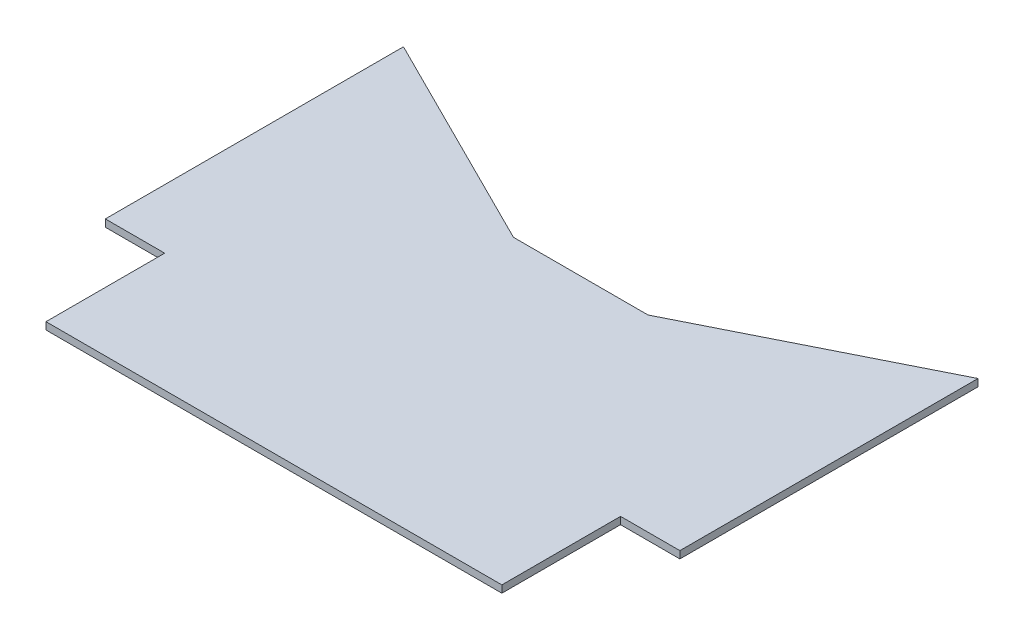
ISO-10303-21;
HEADER;
FILE_DESCRIPTION(('STEP AP214'),'2;1');
FILE_NAME('part.step','',(''),(''),'','','');
FILE_SCHEMA(('AUTOMOTIVE_DESIGN { 1 0 10303 214 1 1 1 1 }'));
ENDSEC;
DATA;
#1=APPLICATION_CONTEXT('core data for automotive mechanical design processes');
#2=APPLICATION_PROTOCOL_DEFINITION('international standard','automotive_design',2000,#1);
#3=PRODUCT_CONTEXT('',#1,'mechanical');
#4=PRODUCT('Part','Part','',(#3));
#5=PRODUCT_RELATED_PRODUCT_CATEGORY('part','',(#4));
#6=PRODUCT_DEFINITION_FORMATION('','',#4);
#7=PRODUCT_DEFINITION_CONTEXT('part definition',#1,'design');
#8=PRODUCT_DEFINITION('design','',#6,#7);
#9=PRODUCT_DEFINITION_SHAPE('','',#8);
#10=(LENGTH_UNIT() NAMED_UNIT(*) SI_UNIT(.MILLI.,.METRE.));
#11=(NAMED_UNIT(*) PLANE_ANGLE_UNIT() SI_UNIT($,.RADIAN.));
#12=(NAMED_UNIT(*) SI_UNIT($,.STERADIAN.) SOLID_ANGLE_UNIT());
#13=UNCERTAINTY_MEASURE_WITH_UNIT(LENGTH_MEASURE(1.E-05),#10,'distance_accuracy_value','');
#14=(GEOMETRIC_REPRESENTATION_CONTEXT(3) GLOBAL_UNCERTAINTY_ASSIGNED_CONTEXT((#13)) GLOBAL_UNIT_ASSIGNED_CONTEXT((#10,
#11,#12)) REPRESENTATION_CONTEXT('',''));
#15=CARTESIAN_POINT('',(0.,0.,0.));
#16=DIRECTION('',(0.,0.,1.));
#17=DIRECTION('',(1.,0.,0.));
#18=AXIS2_PLACEMENT_3D('',#15,#16,#17);
#19=CARTESIAN_POINT('',(-100.838,2.54,-146.304));
#20=DIRECTION('',(-0.447213595499958,0.,0.894427190999916));
#21=DIRECTION('',(0.894427190999916,0.,0.447213595499958));
#22=AXIS2_PLACEMENT_3D('',#19,#20,#21);
#23=PLANE('',#22);
#24=DIRECTION('',(-0.894427190999916,0.,-0.447213595499958));
#25=VECTOR('',#24,1.);
#26=CARTESIAN_POINT('',(-100.838,0.,-146.304));
#27=LINE('',#26,#25);
#28=CARTESIAN_POINT('',(-23.622,0.,-107.696));
#29=VERTEX_POINT('',#28);
#30=CARTESIAN_POINT('',(-100.838,0.,-146.304));
#31=VERTEX_POINT('',#30);
#32=EDGE_CURVE('E140',#29,#31,#27,.T.);
#33=ORIENTED_EDGE('',*,*,#32,.T.);
#34=DIRECTION('',(0.,-1.,0.));
#35=VECTOR('',#34,1.);
#36=CARTESIAN_POINT('',(-100.838,2.54,-146.304));
#37=LINE('',#36,#35);
#38=CARTESIAN_POINT('',(-100.838,2.54,-146.304));
#39=VERTEX_POINT('',#38);
#40=EDGE_CURVE('E11',#39,#31,#37,.T.);
#41=ORIENTED_EDGE('',*,*,#40,.F.);
#42=DIRECTION('',(-0.894427190999916,0.,-0.447213595499958));
#43=VECTOR('',#42,1.);
#44=CARTESIAN_POINT('',(-100.838,2.54,-146.304));
#45=LINE('',#44,#43);
#46=CARTESIAN_POINT('',(-23.622,2.54,-107.696));
#47=VERTEX_POINT('',#46);
#48=EDGE_CURVE('E159',#47,#39,#45,.T.);
#49=ORIENTED_EDGE('',*,*,#48,.F.);
#50=DIRECTION('',(0.,-1.,0.));
#51=VECTOR('',#50,1.);
#52=CARTESIAN_POINT('',(-23.622,2.54,-107.696));
#53=LINE('',#52,#51);
#54=EDGE_CURVE('E136',#47,#29,#53,.T.);
#55=ORIENTED_EDGE('',*,*,#54,.T.);
#56=EDGE_LOOP('',(#33,#41,#49,#55));
#57=FACE_BOUND('',#56,.T.);
#58=ADVANCED_FACE('F33',(#57),#23,.F.);
#59=CARTESIAN_POINT('',(-100.838,2.54,-41.656));
#60=DIRECTION('',(1.,0.,0.));
#61=DIRECTION('',(0.,0.,-1.));
#62=AXIS2_PLACEMENT_3D('',#59,#60,#61);
#63=PLANE('',#62);
#64=DIRECTION('',(0.,0.,1.));
#65=VECTOR('',#64,1.);
#66=CARTESIAN_POINT('',(-100.838,0.,-41.656));
#67=LINE('',#66,#65);
#68=CARTESIAN_POINT('',(-100.838,0.,-41.656));
#69=VERTEX_POINT('',#68);
#70=EDGE_CURVE('E143',#31,#69,#67,.T.);
#71=ORIENTED_EDGE('',*,*,#70,.T.);
#72=DIRECTION('',(0.,-1.,0.));
#73=VECTOR('',#72,1.);
#74=CARTESIAN_POINT('',(-100.838,2.54,-41.656));
#75=LINE('',#74,#73);
#76=CARTESIAN_POINT('',(-100.838,2.54,-41.656));
#77=VERTEX_POINT('',#76);
#78=EDGE_CURVE('E41',#77,#69,#75,.T.);
#79=ORIENTED_EDGE('',*,*,#78,.F.);
#80=DIRECTION('',(0.,0.,1.));
#81=VECTOR('',#80,1.);
#82=CARTESIAN_POINT('',(-100.838,2.54,-51.308));
#83=LINE('',#82,#81);
#84=EDGE_CURVE('E98',#39,#77,#83,.T.);
#85=ORIENTED_EDGE('',*,*,#84,.F.);
#86=ORIENTED_EDGE('',*,*,#40,.T.);
#87=EDGE_LOOP('',(#71,#79,#85,#86));
#88=FACE_BOUND('',#87,.T.);
#89=ADVANCED_FACE('F208',(#88),#63,.F.);
#90=CARTESIAN_POINT('',(-80.01,2.54,-41.656));
#91=DIRECTION('',(0.,0.,-1.));
#92=DIRECTION('',(-1.,0.,0.));
#93=AXIS2_PLACEMENT_3D('',#90,#91,#92);
#94=PLANE('',#93);
#95=DIRECTION('',(1.,0.,0.));
#96=VECTOR('',#95,1.);
#97=CARTESIAN_POINT('',(-80.01,0.,-41.656));
#98=LINE('',#97,#96);
#99=CARTESIAN_POINT('',(-80.01,0.,-41.656));
#100=VERTEX_POINT('',#99);
#101=EDGE_CURVE('E145',#69,#100,#98,.T.);
#102=ORIENTED_EDGE('',*,*,#101,.T.);
#103=DIRECTION('',(0.,-1.,0.));
#104=VECTOR('',#103,1.);
#105=CARTESIAN_POINT('',(-80.01,2.54,-41.656));
#106=LINE('',#105,#104);
#107=CARTESIAN_POINT('',(-80.01,2.54,-41.656));
#108=VERTEX_POINT('',#107);
#109=EDGE_CURVE('E172',#108,#100,#106,.T.);
#110=ORIENTED_EDGE('',*,*,#109,.F.);
#111=DIRECTION('',(1.,0.,0.));
#112=VECTOR('',#111,1.);
#113=CARTESIAN_POINT('',(-80.01,2.54,-41.656));
#114=LINE('',#113,#112);
#115=EDGE_CURVE('E180',#77,#108,#114,.T.);
#116=ORIENTED_EDGE('',*,*,#115,.F.);
#117=ORIENTED_EDGE('',*,*,#78,.T.);
#118=EDGE_LOOP('',(#102,#110,#116,#117));
#119=FACE_BOUND('',#118,.T.);
#120=ADVANCED_FACE('F178',(#119),#94,.F.);
#121=CARTESIAN_POINT('',(-80.01,2.54,0.));
#122=DIRECTION('',(1.,0.,0.));
#123=DIRECTION('',(0.,0.,-1.));
#124=AXIS2_PLACEMENT_3D('',#121,#122,#123);
#125=PLANE('',#124);
#126=DIRECTION('',(0.,0.,1.));
#127=VECTOR('',#126,1.);
#128=CARTESIAN_POINT('',(-80.01,0.,0.));
#129=LINE('',#128,#127);
#130=CARTESIAN_POINT('',(-80.01,0.,0.));
#131=VERTEX_POINT('',#130);
#132=EDGE_CURVE('E147',#100,#131,#129,.T.);
#133=ORIENTED_EDGE('',*,*,#132,.T.);
#134=DIRECTION('',(0.,-1.,0.));
#135=VECTOR('',#134,1.);
#136=CARTESIAN_POINT('',(-80.01,2.54,0.));
#137=LINE('',#136,#135);
#138=CARTESIAN_POINT('',(-80.01,2.54,0.));
#139=VERTEX_POINT('',#138);
#140=EDGE_CURVE('E169',#139,#131,#137,.T.);
#141=ORIENTED_EDGE('',*,*,#140,.F.);
#142=DIRECTION('',(0.,0.,1.));
#143=VECTOR('',#142,1.);
#144=CARTESIAN_POINT('',(-80.01,2.54,0.));
#145=LINE('',#144,#143);
#146=EDGE_CURVE('E198',#108,#139,#145,.T.);
#147=ORIENTED_EDGE('',*,*,#146,.F.);
#148=ORIENTED_EDGE('',*,*,#109,.T.);
#149=EDGE_LOOP('',(#133,#141,#147,#148));
#150=FACE_BOUND('',#149,.T.);
#151=ADVANCED_FACE('F189',(#150),#125,.F.);
#152=CARTESIAN_POINT('',(-80.01,2.54,0.));
#153=DIRECTION('',(0.,0.,-1.));
#154=DIRECTION('',(-1.,0.,0.));
#155=AXIS2_PLACEMENT_3D('',#152,#153,#154);
#156=PLANE('',#155);
#157=DIRECTION('',(1.,0.,0.));
#158=VECTOR('',#157,1.);
#159=CARTESIAN_POINT('',(-80.01,0.,0.));
#160=LINE('',#159,#158);
#161=CARTESIAN_POINT('',(80.01,0.,0.));
#162=VERTEX_POINT('',#161);
#163=EDGE_CURVE('E149',#131,#162,#160,.T.);
#164=ORIENTED_EDGE('',*,*,#163,.T.);
#165=DIRECTION('',(0.,-1.,0.));
#166=VECTOR('',#165,1.);
#167=CARTESIAN_POINT('',(80.01,2.54,0.));
#168=LINE('',#167,#166);
#169=CARTESIAN_POINT('',(80.01,2.54,0.));
#170=VERTEX_POINT('',#169);
#171=EDGE_CURVE('E166',#170,#162,#168,.T.);
#172=ORIENTED_EDGE('',*,*,#171,.F.);
#173=DIRECTION('',(1.,0.,0.));
#174=VECTOR('',#173,1.);
#175=CARTESIAN_POINT('',(-80.01,2.54,0.));
#176=LINE('',#175,#174);
#177=EDGE_CURVE('E195',#139,#170,#176,.T.);
#178=ORIENTED_EDGE('',*,*,#177,.F.);
#179=ORIENTED_EDGE('',*,*,#140,.T.);
#180=EDGE_LOOP('',(#164,#172,#178,#179));
#181=FACE_BOUND('',#180,.T.);
#182=ADVANCED_FACE('F193',(#181),#156,.F.);
#183=CARTESIAN_POINT('',(80.01,2.54,0.));
#184=DIRECTION('',(-1.,0.,0.));
#185=DIRECTION('',(0.,0.,1.));
#186=AXIS2_PLACEMENT_3D('',#183,#184,#185);
#187=PLANE('',#186);
#188=DIRECTION('',(0.,0.,-1.));
#189=VECTOR('',#188,1.);
#190=CARTESIAN_POINT('',(80.01,0.,0.));
#191=LINE('',#190,#189);
#192=CARTESIAN_POINT('',(80.01,0.,-41.656));
#193=VERTEX_POINT('',#192);
#194=EDGE_CURVE('E151',#162,#193,#191,.T.);
#195=ORIENTED_EDGE('',*,*,#194,.T.);
#196=DIRECTION('',(0.,-1.,0.));
#197=VECTOR('',#196,1.);
#198=CARTESIAN_POINT('',(80.01,2.54,-41.656));
#199=LINE('',#198,#197);
#200=CARTESIAN_POINT('',(80.01,2.54,-41.656));
#201=VERTEX_POINT('',#200);
#202=EDGE_CURVE('E163',#201,#193,#199,.T.);
#203=ORIENTED_EDGE('',*,*,#202,.F.);
#204=DIRECTION('',(0.,0.,-1.));
#205=VECTOR('',#204,1.);
#206=CARTESIAN_POINT('',(80.01,2.54,0.));
#207=LINE('',#206,#205);
#208=EDGE_CURVE('E197',#170,#201,#207,.T.);
#209=ORIENTED_EDGE('',*,*,#208,.F.);
#210=ORIENTED_EDGE('',*,*,#171,.T.);
#211=EDGE_LOOP('',(#195,#203,#209,#210));
#212=FACE_BOUND('',#211,.T.);
#213=ADVANCED_FACE('F220',(#212),#187,.F.);
#214=CARTESIAN_POINT('',(80.01,2.54,-41.656));
#215=DIRECTION('',(0.,0.,-1.));
#216=DIRECTION('',(-1.,0.,0.));
#217=AXIS2_PLACEMENT_3D('',#214,#215,#216);
#218=PLANE('',#217);
#219=DIRECTION('',(1.,0.,0.));
#220=VECTOR('',#219,1.);
#221=CARTESIAN_POINT('',(80.01,0.,-41.656));
#222=LINE('',#221,#220);
#223=CARTESIAN_POINT('',(100.838,0.,-41.656));
#224=VERTEX_POINT('',#223);
#225=EDGE_CURVE('E153',#193,#224,#222,.T.);
#226=ORIENTED_EDGE('',*,*,#225,.T.);
#227=DIRECTION('',(0.,-1.,0.));
#228=VECTOR('',#227,1.);
#229=CARTESIAN_POINT('',(100.838,2.54,-41.656));
#230=LINE('',#229,#228);
#231=CARTESIAN_POINT('',(100.838,2.54,-41.656));
#232=VERTEX_POINT('',#231);
#233=EDGE_CURVE('E131',#232,#224,#230,.T.);
#234=ORIENTED_EDGE('',*,*,#233,.F.);
#235=DIRECTION('',(1.,0.,0.));
#236=VECTOR('',#235,1.);
#237=CARTESIAN_POINT('',(80.01,2.54,-41.656));
#238=LINE('',#237,#236);
#239=EDGE_CURVE('E123',#201,#232,#238,.T.);
#240=ORIENTED_EDGE('',*,*,#239,.F.);
#241=ORIENTED_EDGE('',*,*,#202,.T.);
#242=EDGE_LOOP('',(#226,#234,#240,#241));
#243=FACE_BOUND('',#242,.T.);
#244=ADVANCED_FACE('F223',(#243),#218,.F.);
#245=CARTESIAN_POINT('',(100.838,2.54,-51.308));
#246=DIRECTION('',(-1.,0.,0.));
#247=DIRECTION('',(0.,0.,1.));
#248=AXIS2_PLACEMENT_3D('',#245,#246,#247);
#249=PLANE('',#248);
#250=DIRECTION('',(0.,0.,-1.));
#251=VECTOR('',#250,1.);
#252=CARTESIAN_POINT('',(100.838,0.,-51.308));
#253=LINE('',#252,#251);
#254=CARTESIAN_POINT('',(100.838,0.,-146.304));
#255=VERTEX_POINT('',#254);
#256=EDGE_CURVE('E130',#224,#255,#253,.T.);
#257=ORIENTED_EDGE('',*,*,#256,.T.);
#258=DIRECTION('',(0.,-1.,0.));
#259=VECTOR('',#258,1.);
#260=CARTESIAN_POINT('',(100.838,2.54,-146.304));
#261=LINE('',#260,#259);
#262=CARTESIAN_POINT('',(100.838,2.54,-146.304));
#263=VERTEX_POINT('',#262);
#264=EDGE_CURVE('E128',#263,#255,#261,.T.);
#265=ORIENTED_EDGE('',*,*,#264,.F.);
#266=DIRECTION('',(0.,0.,-1.));
#267=VECTOR('',#266,1.);
#268=CARTESIAN_POINT('',(100.838,2.54,-41.656));
#269=LINE('',#268,#267);
#270=EDGE_CURVE('E117',#232,#263,#269,.T.);
#271=ORIENTED_EDGE('',*,*,#270,.F.);
#272=ORIENTED_EDGE('',*,*,#233,.T.);
#273=EDGE_LOOP('',(#257,#265,#271,#272));
#274=FACE_BOUND('',#273,.T.);
#275=ADVANCED_FACE('F129',(#274),#249,.F.);
#276=CARTESIAN_POINT('',(100.838,2.54,-146.304));
#277=DIRECTION('',(0.447213595499958,0.,0.894427190999916));
#278=DIRECTION('',(0.894427190999916,0.,-0.447213595499958));
#279=AXIS2_PLACEMENT_3D('',#276,#277,#278);
#280=PLANE('',#279);
#281=DIRECTION('',(-0.894427190999916,0.,0.447213595499958));
#282=VECTOR('',#281,1.);
#283=CARTESIAN_POINT('',(100.838,0.,-146.304));
#284=LINE('',#283,#282);
#285=CARTESIAN_POINT('',(23.622,0.,-107.696));
#286=VERTEX_POINT('',#285);
#287=EDGE_CURVE('E84',#255,#286,#284,.T.);
#288=ORIENTED_EDGE('',*,*,#287,.T.);
#289=DIRECTION('',(0.,-1.,0.));
#290=VECTOR('',#289,1.);
#291=CARTESIAN_POINT('',(23.622,2.54,-107.696));
#292=LINE('',#291,#290);
#293=CARTESIAN_POINT('',(23.622,2.54,-107.696));
#294=VERTEX_POINT('',#293);
#295=EDGE_CURVE('E132',#294,#286,#292,.T.);
#296=ORIENTED_EDGE('',*,*,#295,.F.);
#297=DIRECTION('',(-0.894427190999916,0.,0.447213595499958));
#298=VECTOR('',#297,1.);
#299=CARTESIAN_POINT('',(100.838,2.54,-146.304));
#300=LINE('',#299,#298);
#301=EDGE_CURVE('E121',#263,#294,#300,.T.);
#302=ORIENTED_EDGE('',*,*,#301,.F.);
#303=ORIENTED_EDGE('',*,*,#264,.T.);
#304=EDGE_LOOP('',(#288,#296,#302,#303));
#305=FACE_BOUND('',#304,.T.);
#306=ADVANCED_FACE('F134',(#305),#280,.F.);
#307=CARTESIAN_POINT('',(-23.622,2.54,-107.696));
#308=DIRECTION('',(0.,0.,1.));
#309=DIRECTION('',(1.,0.,0.));
#310=AXIS2_PLACEMENT_3D('',#307,#308,#309);
#311=PLANE('',#310);
#312=DIRECTION('',(-1.,0.,0.));
#313=VECTOR('',#312,1.);
#314=CARTESIAN_POINT('',(-23.622,0.,-107.696));
#315=LINE('',#314,#313);
#316=EDGE_CURVE('E90',#286,#29,#315,.T.);
#317=ORIENTED_EDGE('',*,*,#316,.T.);
#318=ORIENTED_EDGE('',*,*,#54,.F.);
#319=DIRECTION('',(-1.,0.,0.));
#320=VECTOR('',#319,1.);
#321=CARTESIAN_POINT('',(-23.622,2.54,-107.696));
#322=LINE('',#321,#320);
#323=EDGE_CURVE('E49',#294,#47,#322,.T.);
#324=ORIENTED_EDGE('',*,*,#323,.F.);
#325=ORIENTED_EDGE('',*,*,#295,.T.);
#326=EDGE_LOOP('',(#317,#318,#324,#325));
#327=FACE_BOUND('',#326,.T.);
#328=ADVANCED_FACE('F232',(#327),#311,.F.);
#329=CARTESIAN_POINT('',(0.,2.54,0.));
#330=DIRECTION('',(0.,1.,0.));
#331=DIRECTION('',(0.,0.,1.));
#332=AXIS2_PLACEMENT_3D('',#329,#330,#331);
#333=PLANE('',#332);
#334=ORIENTED_EDGE('',*,*,#48,.T.);
#335=ORIENTED_EDGE('',*,*,#84,.T.);
#336=ORIENTED_EDGE('',*,*,#115,.T.);
#337=ORIENTED_EDGE('',*,*,#146,.T.);
#338=ORIENTED_EDGE('',*,*,#177,.T.);
#339=ORIENTED_EDGE('',*,*,#208,.T.);
#340=ORIENTED_EDGE('',*,*,#239,.T.);
#341=ORIENTED_EDGE('',*,*,#270,.T.);
#342=ORIENTED_EDGE('',*,*,#301,.T.);
#343=ORIENTED_EDGE('',*,*,#323,.T.);
#344=EDGE_LOOP('',(#334,#335,#336,#337,#338,#339,#340,#341,#342,#343));
#345=FACE_BOUND('',#344,.T.);
#346=ADVANCED_FACE('F119',(#345),#333,.T.);
#347=CARTESIAN_POINT('',(0.,0.,0.));
#348=DIRECTION('',(0.,1.,0.));
#349=DIRECTION('',(0.,0.,1.));
#350=AXIS2_PLACEMENT_3D('',#347,#348,#349);
#351=PLANE('',#350);
#352=ORIENTED_EDGE('',*,*,#32,.F.);
#353=ORIENTED_EDGE('',*,*,#316,.F.);
#354=ORIENTED_EDGE('',*,*,#287,.F.);
#355=ORIENTED_EDGE('',*,*,#256,.F.);
#356=ORIENTED_EDGE('',*,*,#225,.F.);
#357=ORIENTED_EDGE('',*,*,#194,.F.);
#358=ORIENTED_EDGE('',*,*,#163,.F.);
#359=ORIENTED_EDGE('',*,*,#132,.F.);
#360=ORIENTED_EDGE('',*,*,#101,.F.);
#361=ORIENTED_EDGE('',*,*,#70,.F.);
#362=EDGE_LOOP('',(#352,#353,#354,#355,#356,#357,#358,#359,#360,#361));
#363=FACE_BOUND('',#362,.T.);
#364=ADVANCED_FACE('F184',(#363),#351,.F.);
#365=CLOSED_SHELL('',(#58,#89,#120,#151,#182,#213,#244,#275,#306,#328,#346,#364));
#366=MANIFOLD_SOLID_BREP('B2',#365);
#367=ADVANCED_BREP_SHAPE_REPRESENTATION('',(#18,#366),#14);
#368=SHAPE_DEFINITION_REPRESENTATION(#9,#367);
ENDSEC;
END-ISO-10303-21;
